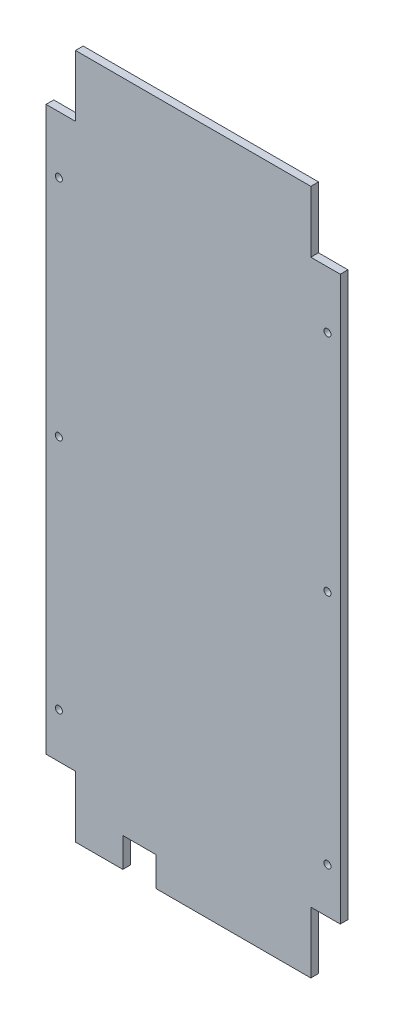
ISO-10303-21;
HEADER;
FILE_DESCRIPTION(('STEP AP214'),'2;1');
FILE_NAME('part.step','',(''),(''),'','','');
FILE_SCHEMA(('AUTOMOTIVE_DESIGN { 1 0 10303 214 1 1 1 1 }'));
ENDSEC;
DATA;
#1=APPLICATION_CONTEXT('core data for automotive mechanical design processes');
#2=APPLICATION_PROTOCOL_DEFINITION('international standard','automotive_design',2000,#1);
#3=PRODUCT_CONTEXT('',#1,'mechanical');
#4=PRODUCT('Part','Part','',(#3));
#5=PRODUCT_RELATED_PRODUCT_CATEGORY('part','',(#4));
#6=PRODUCT_DEFINITION_FORMATION('','',#4);
#7=PRODUCT_DEFINITION_CONTEXT('part definition',#1,'design');
#8=PRODUCT_DEFINITION('design','',#6,#7);
#9=PRODUCT_DEFINITION_SHAPE('','',#8);
#10=(LENGTH_UNIT() NAMED_UNIT(*) SI_UNIT(.MILLI.,.METRE.));
#11=(NAMED_UNIT(*) PLANE_ANGLE_UNIT() SI_UNIT($,.RADIAN.));
#12=(NAMED_UNIT(*) SI_UNIT($,.STERADIAN.) SOLID_ANGLE_UNIT());
#13=UNCERTAINTY_MEASURE_WITH_UNIT(LENGTH_MEASURE(1.E-05),#10,'distance_accuracy_value','');
#14=(GEOMETRIC_REPRESENTATION_CONTEXT(3) GLOBAL_UNCERTAINTY_ASSIGNED_CONTEXT((#13)) GLOBAL_UNIT_ASSIGNED_CONTEXT((#10,
#11,#12)) REPRESENTATION_CONTEXT('',''));
#15=CARTESIAN_POINT('',(0.,0.,0.));
#16=DIRECTION('',(0.,0.,1.));
#17=DIRECTION('',(1.,0.,0.));
#18=AXIS2_PLACEMENT_3D('',#15,#16,#17);
#19=CARTESIAN_POINT('',(-88.1852192827483,97.4126937302868,6.));
#20=DIRECTION('',(0.,-1.,0.));
#21=DIRECTION('',(0.,0.,-1.));
#22=AXIS2_PLACEMENT_3D('',#19,#20,#21);
#23=PLANE('',#22);
#24=DIRECTION('',(-1.,0.,0.));
#25=VECTOR('',#24,1.);
#26=CARTESIAN_POINT('',(-88.1852192827483,97.4126937302868,0.));
#27=LINE('',#26,#25);
#28=CARTESIAN_POINT('',(95.8147807172518,97.4126937302868,0.));
#29=VERTEX_POINT('',#28);
#30=CARTESIAN_POINT('',(-88.1852192827483,97.4126937302868,0.));
#31=VERTEX_POINT('',#30);
#32=EDGE_CURVE('E176',#29,#31,#27,.T.);
#33=ORIENTED_EDGE('',*,*,#32,.T.);
#34=DIRECTION('',(0.,0.,-1.));
#35=VECTOR('',#34,1.);
#36=CARTESIAN_POINT('',(-88.1852192827483,97.4126937302868,6.));
#37=LINE('',#36,#35);
#38=CARTESIAN_POINT('',(-88.1852192827483,97.4126937302868,6.));
#39=VERTEX_POINT('',#38);
#40=EDGE_CURVE('E11',#39,#31,#37,.T.);
#41=ORIENTED_EDGE('',*,*,#40,.F.);
#42=DIRECTION('',(-1.,0.,0.));
#43=VECTOR('',#42,1.);
#44=CARTESIAN_POINT('',(-88.1852192827483,97.4126937302868,6.));
#45=LINE('',#44,#43);
#46=CARTESIAN_POINT('',(95.8147807172518,97.4126937302868,6.));
#47=VERTEX_POINT('',#46);
#48=EDGE_CURVE('E207',#47,#39,#45,.T.);
#49=ORIENTED_EDGE('',*,*,#48,.F.);
#50=DIRECTION('',(0.,0.,-1.));
#51=VECTOR('',#50,1.);
#52=CARTESIAN_POINT('',(95.8147807172518,97.4126937302868,6.));
#53=LINE('',#52,#51);
#54=EDGE_CURVE('E172',#47,#29,#53,.T.);
#55=ORIENTED_EDGE('',*,*,#54,.T.);
#56=EDGE_LOOP('',(#33,#41,#49,#55));
#57=FACE_BOUND('',#56,.T.);
#58=ADVANCED_FACE('F32',(#57),#23,.F.);
#59=CARTESIAN_POINT('',(-88.1852192827483,49.4126937302866,6.));
#60=DIRECTION('',(1.,0.,0.));
#61=DIRECTION('',(0.,0.,-1.));
#62=AXIS2_PLACEMENT_3D('',#59,#60,#61);
#63=PLANE('',#62);
#64=DIRECTION('',(0.,-1.,0.));
#65=VECTOR('',#64,1.);
#66=CARTESIAN_POINT('',(-88.1852192827483,49.4126937302866,0.));
#67=LINE('',#66,#65);
#68=CARTESIAN_POINT('',(-88.1852192827483,49.4126937302866,0.));
#69=VERTEX_POINT('',#68);
#70=EDGE_CURVE('E179',#31,#69,#67,.T.);
#71=ORIENTED_EDGE('',*,*,#70,.T.);
#72=DIRECTION('',(0.,0.,-1.));
#73=VECTOR('',#72,1.);
#74=CARTESIAN_POINT('',(-88.1852192827483,49.4126937302866,6.));
#75=LINE('',#74,#73);
#76=CARTESIAN_POINT('',(-88.1852192827483,49.4126937302866,6.));
#77=VERTEX_POINT('',#76);
#78=EDGE_CURVE('E40',#77,#69,#75,.T.);
#79=ORIENTED_EDGE('',*,*,#78,.F.);
#80=DIRECTION('',(0.,-1.,0.));
#81=VECTOR('',#80,1.);
#82=CARTESIAN_POINT('',(-88.1852192827483,49.4126937302866,6.));
#83=LINE('',#82,#81);
#84=EDGE_CURVE('E115',#39,#77,#83,.T.);
#85=ORIENTED_EDGE('',*,*,#84,.F.);
#86=ORIENTED_EDGE('',*,*,#40,.T.);
#87=EDGE_LOOP('',(#71,#79,#85,#86));
#88=FACE_BOUND('',#87,.T.);
#89=ADVANCED_FACE('F307',(#88),#63,.F.);
#90=CARTESIAN_POINT('',(-111.185219282748,49.4126937302866,6.));
#91=DIRECTION('',(0.,-1.,0.));
#92=DIRECTION('',(0.,0.,-1.));
#93=AXIS2_PLACEMENT_3D('',#90,#91,#92);
#94=PLANE('',#93);
#95=DIRECTION('',(-1.,0.,0.));
#96=VECTOR('',#95,1.);
#97=CARTESIAN_POINT('',(-111.185219282748,49.4126937302866,0.));
#98=LINE('',#97,#96);
#99=CARTESIAN_POINT('',(-111.185219282748,49.4126937302866,0.));
#100=VERTEX_POINT('',#99);
#101=EDGE_CURVE('E182',#69,#100,#98,.T.);
#102=ORIENTED_EDGE('',*,*,#101,.T.);
#103=DIRECTION('',(0.,0.,-1.));
#104=VECTOR('',#103,1.);
#105=CARTESIAN_POINT('',(-111.185219282748,49.4126937302866,6.));
#106=LINE('',#105,#104);
#107=CARTESIAN_POINT('',(-111.185219282748,49.4126937302866,6.));
#108=VERTEX_POINT('',#107);
#109=EDGE_CURVE('E238',#108,#100,#106,.T.);
#110=ORIENTED_EDGE('',*,*,#109,.F.);
#111=DIRECTION('',(-1.,0.,0.));
#112=VECTOR('',#111,1.);
#113=CARTESIAN_POINT('',(-111.185219282748,49.4126937302866,6.));
#114=LINE('',#113,#112);
#115=EDGE_CURVE('E246',#77,#108,#114,.T.);
#116=ORIENTED_EDGE('',*,*,#115,.F.);
#117=ORIENTED_EDGE('',*,*,#78,.T.);
#118=EDGE_LOOP('',(#102,#110,#116,#117));
#119=FACE_BOUND('',#118,.T.);
#120=ADVANCED_FACE('F244',(#119),#94,.F.);
#121=CARTESIAN_POINT('',(-111.185219282748,49.4126937302866,6.));
#122=DIRECTION('',(1.,0.,0.));
#123=DIRECTION('',(0.,1.,0.));
#124=AXIS2_PLACEMENT_3D('',#121,#122,#123);
#125=PLANE('',#124);
#126=DIRECTION('',(0.,-1.,0.));
#127=VECTOR('',#126,1.);
#128=CARTESIAN_POINT('',(-111.185219282748,49.4126937302866,0.));
#129=LINE('',#128,#127);
#130=CARTESIAN_POINT('',(-111.185219282748,-390.587306269713,0.));
#131=VERTEX_POINT('',#130);
#132=EDGE_CURVE('E184',#100,#131,#129,.T.);
#133=ORIENTED_EDGE('',*,*,#132,.T.);
#134=DIRECTION('',(0.,0.,-1.));
#135=VECTOR('',#134,1.);
#136=CARTESIAN_POINT('',(-111.185219282748,-390.587306269713,6.));
#137=LINE('',#136,#135);
#138=CARTESIAN_POINT('',(-111.185219282748,-390.587306269713,6.));
#139=VERTEX_POINT('',#138);
#140=EDGE_CURVE('E235',#139,#131,#137,.T.);
#141=ORIENTED_EDGE('',*,*,#140,.F.);
#142=DIRECTION('',(0.,-1.,0.));
#143=VECTOR('',#142,1.);
#144=CARTESIAN_POINT('',(-111.185219282748,49.4126937302866,6.));
#145=LINE('',#144,#143);
#146=EDGE_CURVE('E264',#108,#139,#145,.T.);
#147=ORIENTED_EDGE('',*,*,#146,.F.);
#148=ORIENTED_EDGE('',*,*,#109,.T.);
#149=EDGE_LOOP('',(#133,#141,#147,#148));
#150=FACE_BOUND('',#149,.T.);
#151=ADVANCED_FACE('F255',(#150),#125,.F.);
#152=CARTESIAN_POINT('',(-88.1852192827483,-390.587306269713,6.));
#153=DIRECTION('',(0.,1.,0.));
#154=DIRECTION('',(-1.,0.,0.));
#155=AXIS2_PLACEMENT_3D('',#152,#153,#154);
#156=PLANE('',#155);
#157=DIRECTION('',(1.,0.,0.));
#158=VECTOR('',#157,1.);
#159=CARTESIAN_POINT('',(-88.1852192827483,-390.587306269713,0.));
#160=LINE('',#159,#158);
#161=CARTESIAN_POINT('',(-88.1852192827483,-390.587306269713,0.));
#162=VERTEX_POINT('',#161);
#163=EDGE_CURVE('E186',#131,#162,#160,.T.);
#164=ORIENTED_EDGE('',*,*,#163,.T.);
#165=DIRECTION('',(0.,0.,-1.));
#166=VECTOR('',#165,1.);
#167=CARTESIAN_POINT('',(-88.1852192827483,-390.587306269713,6.));
#168=LINE('',#167,#166);
#169=CARTESIAN_POINT('',(-88.1852192827483,-390.587306269713,6.));
#170=VERTEX_POINT('',#169);
#171=EDGE_CURVE('E232',#170,#162,#168,.T.);
#172=ORIENTED_EDGE('',*,*,#171,.F.);
#173=DIRECTION('',(1.,0.,0.));
#174=VECTOR('',#173,1.);
#175=CARTESIAN_POINT('',(-88.1852192827483,-390.587306269713,6.));
#176=LINE('',#175,#174);
#177=EDGE_CURVE('E261',#139,#170,#176,.T.);
#178=ORIENTED_EDGE('',*,*,#177,.F.);
#179=ORIENTED_EDGE('',*,*,#140,.T.);
#180=EDGE_LOOP('',(#164,#172,#178,#179));
#181=FACE_BOUND('',#180,.T.);
#182=ADVANCED_FACE('F259',(#181),#156,.F.);
#183=CARTESIAN_POINT('',(-88.1852192827483,-438.58730627295,6.));
#184=DIRECTION('',(1.,0.,0.));
#185=DIRECTION('',(0.,1.,0.));
#186=AXIS2_PLACEMENT_3D('',#183,#184,#185);
#187=PLANE('',#186);
#188=DIRECTION('',(0.,-1.,0.));
#189=VECTOR('',#188,1.);
#190=CARTESIAN_POINT('',(-88.1852192827483,-438.58730627295,0.));
#191=LINE('',#190,#189);
#192=CARTESIAN_POINT('',(-88.1852192827483,-438.58730627295,0.));
#193=VERTEX_POINT('',#192);
#194=EDGE_CURVE('E188',#162,#193,#191,.T.);
#195=ORIENTED_EDGE('',*,*,#194,.T.);
#196=DIRECTION('',(0.,0.,-1.));
#197=VECTOR('',#196,1.);
#198=CARTESIAN_POINT('',(-88.1852192827483,-438.58730627295,6.));
#199=LINE('',#198,#197);
#200=CARTESIAN_POINT('',(-88.1852192827483,-438.58730627295,6.));
#201=VERTEX_POINT('',#200);
#202=EDGE_CURVE('E229',#201,#193,#199,.T.);
#203=ORIENTED_EDGE('',*,*,#202,.F.);
#204=DIRECTION('',(0.,-1.,0.));
#205=VECTOR('',#204,1.);
#206=CARTESIAN_POINT('',(-88.1852192827483,-438.58730627295,6.));
#207=LINE('',#206,#205);
#208=EDGE_CURVE('E263',#170,#201,#207,.T.);
#209=ORIENTED_EDGE('',*,*,#208,.F.);
#210=ORIENTED_EDGE('',*,*,#171,.T.);
#211=EDGE_LOOP('',(#195,#203,#209,#210));
#212=FACE_BOUND('',#211,.T.);
#213=ADVANCED_FACE('F320',(#212),#187,.F.);
#214=CARTESIAN_POINT('',(-88.1852192827483,-438.58730627295,6.));
#215=DIRECTION('',(0.,1.,0.));
#216=DIRECTION('',(-1.,0.,0.));
#217=AXIS2_PLACEMENT_3D('',#214,#215,#216);
#218=PLANE('',#217);
#219=DIRECTION('',(1.,0.,0.));
#220=VECTOR('',#219,1.);
#221=CARTESIAN_POINT('',(-88.1852192827483,-438.58730627295,0.));
#222=LINE('',#221,#220);
#223=CARTESIAN_POINT('',(-51.1852192827482,-438.58730627295,0.));
#224=VERTEX_POINT('',#223);
#225=EDGE_CURVE('E190',#193,#224,#222,.T.);
#226=ORIENTED_EDGE('',*,*,#225,.T.);
#227=DIRECTION('',(0.,0.,-1.));
#228=VECTOR('',#227,1.);
#229=CARTESIAN_POINT('',(-51.1852192827482,-438.58730627295,6.));
#230=LINE('',#229,#228);
#231=CARTESIAN_POINT('',(-51.1852192827482,-438.58730627295,6.));
#232=VERTEX_POINT('',#231);
#233=EDGE_CURVE('E226',#232,#224,#230,.T.);
#234=ORIENTED_EDGE('',*,*,#233,.F.);
#235=DIRECTION('',(1.,0.,0.));
#236=VECTOR('',#235,1.);
#237=CARTESIAN_POINT('',(-88.1852192827483,-438.58730627295,6.));
#238=LINE('',#237,#236);
#239=EDGE_CURVE('E266',#201,#232,#238,.T.);
#240=ORIENTED_EDGE('',*,*,#239,.F.);
#241=ORIENTED_EDGE('',*,*,#202,.T.);
#242=EDGE_LOOP('',(#226,#234,#240,#241));
#243=FACE_BOUND('',#242,.T.);
#244=ADVANCED_FACE('F323',(#243),#218,.F.);
#245=CARTESIAN_POINT('',(-51.1852192827482,-415.58730627295,6.));
#246=DIRECTION('',(-1.,0.,0.));
#247=DIRECTION('',(0.,0.,1.));
#248=AXIS2_PLACEMENT_3D('',#245,#246,#247);
#249=PLANE('',#248);
#250=DIRECTION('',(0.,1.,0.));
#251=VECTOR('',#250,1.);
#252=CARTESIAN_POINT('',(-51.1852192827482,-415.58730627295,0.));
#253=LINE('',#252,#251);
#254=CARTESIAN_POINT('',(-51.1852192827482,-415.58730627295,0.));
#255=VERTEX_POINT('',#254);
#256=EDGE_CURVE('E192',#224,#255,#253,.T.);
#257=ORIENTED_EDGE('',*,*,#256,.T.);
#258=DIRECTION('',(0.,0.,-1.));
#259=VECTOR('',#258,1.);
#260=CARTESIAN_POINT('',(-51.1852192827482,-415.58730627295,6.));
#261=LINE('',#260,#259);
#262=CARTESIAN_POINT('',(-51.1852192827482,-415.58730627295,6.));
#263=VERTEX_POINT('',#262);
#264=EDGE_CURVE('E223',#263,#255,#261,.T.);
#265=ORIENTED_EDGE('',*,*,#264,.F.);
#266=DIRECTION('',(0.,1.,0.));
#267=VECTOR('',#266,1.);
#268=CARTESIAN_POINT('',(-51.1852192827482,-415.58730627295,6.));
#269=LINE('',#268,#267);
#270=EDGE_CURVE('E272',#232,#263,#269,.T.);
#271=ORIENTED_EDGE('',*,*,#270,.F.);
#272=ORIENTED_EDGE('',*,*,#233,.T.);
#273=EDGE_LOOP('',(#257,#265,#271,#272));
#274=FACE_BOUND('',#273,.T.);
#275=ADVANCED_FACE('F327',(#274),#249,.F.);
#276=CARTESIAN_POINT('',(-51.1852192827482,-415.58730627295,6.));
#277=DIRECTION('',(0.,1.,0.));
#278=DIRECTION('',(-1.,0.,0.));
#279=AXIS2_PLACEMENT_3D('',#276,#277,#278);
#280=PLANE('',#279);
#281=DIRECTION('',(1.,0.,0.));
#282=VECTOR('',#281,1.);
#283=CARTESIAN_POINT('',(-51.1852192827482,-415.58730627295,0.));
#284=LINE('',#283,#282);
#285=CARTESIAN_POINT('',(-25.1852192827482,-415.58730627295,0.));
#286=VERTEX_POINT('',#285);
#287=EDGE_CURVE('E194',#255,#286,#284,.T.);
#288=ORIENTED_EDGE('',*,*,#287,.T.);
#289=DIRECTION('',(0.,0.,-1.));
#290=VECTOR('',#289,1.);
#291=CARTESIAN_POINT('',(-25.1852192827482,-415.58730627295,6.));
#292=LINE('',#291,#290);
#293=CARTESIAN_POINT('',(-25.1852192827482,-415.58730627295,6.));
#294=VERTEX_POINT('',#293);
#295=EDGE_CURVE('E220',#294,#286,#292,.T.);
#296=ORIENTED_EDGE('',*,*,#295,.F.);
#297=DIRECTION('',(1.,0.,0.));
#298=VECTOR('',#297,1.);
#299=CARTESIAN_POINT('',(-51.1852192827482,-415.58730627295,6.));
#300=LINE('',#299,#298);
#301=EDGE_CURVE('E274',#263,#294,#300,.T.);
#302=ORIENTED_EDGE('',*,*,#301,.F.);
#303=ORIENTED_EDGE('',*,*,#264,.T.);
#304=EDGE_LOOP('',(#288,#296,#302,#303));
#305=FACE_BOUND('',#304,.T.);
#306=ADVANCED_FACE('F331',(#305),#280,.F.);
#307=CARTESIAN_POINT('',(-25.1852192827482,-415.58730627295,6.));
#308=DIRECTION('',(1.,0.,0.));
#309=DIRECTION('',(0.,0.,-1.));
#310=AXIS2_PLACEMENT_3D('',#307,#308,#309);
#311=PLANE('',#310);
#312=DIRECTION('',(0.,-1.,0.));
#313=VECTOR('',#312,1.);
#314=CARTESIAN_POINT('',(-25.1852192827482,-415.58730627295,0.));
#315=LINE('',#314,#313);
#316=CARTESIAN_POINT('',(-25.1852192827482,-438.58730627295,0.));
#317=VERTEX_POINT('',#316);
#318=EDGE_CURVE('E196',#286,#317,#315,.T.);
#319=ORIENTED_EDGE('',*,*,#318,.T.);
#320=DIRECTION('',(0.,0.,-1.));
#321=VECTOR('',#320,1.);
#322=CARTESIAN_POINT('',(-25.1852192827482,-438.58730627295,6.));
#323=LINE('',#322,#321);
#324=CARTESIAN_POINT('',(-25.1852192827482,-438.58730627295,6.));
#325=VERTEX_POINT('',#324);
#326=EDGE_CURVE('E217',#325,#317,#323,.T.);
#327=ORIENTED_EDGE('',*,*,#326,.F.);
#328=DIRECTION('',(0.,-1.,0.));
#329=VECTOR('',#328,1.);
#330=CARTESIAN_POINT('',(-25.1852192827482,-415.58730627295,6.));
#331=LINE('',#330,#329);
#332=EDGE_CURVE('E276',#294,#325,#331,.T.);
#333=ORIENTED_EDGE('',*,*,#332,.F.);
#334=ORIENTED_EDGE('',*,*,#295,.T.);
#335=EDGE_LOOP('',(#319,#327,#333,#334));
#336=FACE_BOUND('',#335,.T.);
#337=ADVANCED_FACE('F335',(#336),#311,.F.);
#338=CARTESIAN_POINT('',(95.8147807172518,-438.58730627295,6.));
#339=DIRECTION('',(0.,1.,0.));
#340=DIRECTION('',(0.,0.,1.));
#341=AXIS2_PLACEMENT_3D('',#338,#339,#340);
#342=PLANE('',#341);
#343=DIRECTION('',(1.,0.,0.));
#344=VECTOR('',#343,1.);
#345=CARTESIAN_POINT('',(95.8147807172518,-438.58730627295,0.));
#346=LINE('',#345,#344);
#347=CARTESIAN_POINT('',(95.8147807172518,-438.58730627295,0.));
#348=VERTEX_POINT('',#347);
#349=EDGE_CURVE('E198',#317,#348,#346,.T.);
#350=ORIENTED_EDGE('',*,*,#349,.T.);
#351=DIRECTION('',(0.,0.,-1.));
#352=VECTOR('',#351,1.);
#353=CARTESIAN_POINT('',(95.8147807172518,-438.58730627295,6.));
#354=LINE('',#353,#352);
#355=CARTESIAN_POINT('',(95.8147807172518,-438.58730627295,6.));
#356=VERTEX_POINT('',#355);
#357=EDGE_CURVE('E214',#356,#348,#354,.T.);
#358=ORIENTED_EDGE('',*,*,#357,.F.);
#359=DIRECTION('',(1.,0.,0.));
#360=VECTOR('',#359,1.);
#361=CARTESIAN_POINT('',(95.8147807172518,-438.58730627295,6.));
#362=LINE('',#361,#360);
#363=EDGE_CURVE('E278',#325,#356,#362,.T.);
#364=ORIENTED_EDGE('',*,*,#363,.F.);
#365=ORIENTED_EDGE('',*,*,#326,.T.);
#366=EDGE_LOOP('',(#350,#358,#364,#365));
#367=FACE_BOUND('',#366,.T.);
#368=ADVANCED_FACE('F339',(#367),#342,.F.);
#369=CARTESIAN_POINT('',(95.8147807172518,-438.58730627295,6.));
#370=DIRECTION('',(-1.,0.,0.));
#371=DIRECTION('',(0.,0.,1.));
#372=AXIS2_PLACEMENT_3D('',#369,#370,#371);
#373=PLANE('',#372);
#374=DIRECTION('',(0.,1.,0.));
#375=VECTOR('',#374,1.);
#376=CARTESIAN_POINT('',(95.8147807172518,-438.58730627295,0.));
#377=LINE('',#376,#375);
#378=CARTESIAN_POINT('',(95.8147807172518,-390.587306269713,0.));
#379=VERTEX_POINT('',#378);
#380=EDGE_CURVE('E200',#348,#379,#377,.T.);
#381=ORIENTED_EDGE('',*,*,#380,.T.);
#382=DIRECTION('',(0.,0.,-1.));
#383=VECTOR('',#382,1.);
#384=CARTESIAN_POINT('',(95.8147807172518,-390.587306269713,6.));
#385=LINE('',#384,#383);
#386=CARTESIAN_POINT('',(95.8147807172518,-390.587306269713,6.));
#387=VERTEX_POINT('',#386);
#388=EDGE_CURVE('E211',#387,#379,#385,.T.);
#389=ORIENTED_EDGE('',*,*,#388,.F.);
#390=DIRECTION('',(0.,1.,0.));
#391=VECTOR('',#390,1.);
#392=CARTESIAN_POINT('',(95.8147807172518,-438.58730627295,6.));
#393=LINE('',#392,#391);
#394=EDGE_CURVE('E280',#356,#387,#393,.T.);
#395=ORIENTED_EDGE('',*,*,#394,.F.);
#396=ORIENTED_EDGE('',*,*,#357,.T.);
#397=EDGE_LOOP('',(#381,#389,#395,#396));
#398=FACE_BOUND('',#397,.T.);
#399=ADVANCED_FACE('F286',(#398),#373,.F.);
#400=CARTESIAN_POINT('',(95.8147807172518,-390.587306269713,6.));
#401=DIRECTION('',(0.,1.,0.));
#402=DIRECTION('',(0.,0.,1.));
#403=AXIS2_PLACEMENT_3D('',#400,#401,#402);
#404=PLANE('',#403);
#405=DIRECTION('',(1.,0.,0.));
#406=VECTOR('',#405,1.);
#407=CARTESIAN_POINT('',(95.8147807172518,-390.587306269713,0.));
#408=LINE('',#407,#406);
#409=CARTESIAN_POINT('',(118.814780717252,-390.587306269713,0.));
#410=VERTEX_POINT('',#409);
#411=EDGE_CURVE('E202',#379,#410,#408,.T.);
#412=ORIENTED_EDGE('',*,*,#411,.T.);
#413=DIRECTION('',(0.,0.,-1.));
#414=VECTOR('',#413,1.);
#415=CARTESIAN_POINT('',(118.814780717252,-390.587306269713,6.));
#416=LINE('',#415,#414);
#417=CARTESIAN_POINT('',(118.814780717252,-390.587306269713,6.));
#418=VERTEX_POINT('',#417);
#419=EDGE_CURVE('E167',#418,#410,#416,.T.);
#420=ORIENTED_EDGE('',*,*,#419,.F.);
#421=DIRECTION('',(1.,0.,0.));
#422=VECTOR('',#421,1.);
#423=CARTESIAN_POINT('',(95.8147807172518,-390.587306269713,6.));
#424=LINE('',#423,#422);
#425=EDGE_CURVE('E158',#387,#418,#424,.T.);
#426=ORIENTED_EDGE('',*,*,#425,.F.);
#427=ORIENTED_EDGE('',*,*,#388,.T.);
#428=EDGE_LOOP('',(#412,#420,#426,#427));
#429=FACE_BOUND('',#428,.T.);
#430=ADVANCED_FACE('F290',(#429),#404,.F.);
#431=CARTESIAN_POINT('',(118.814780717252,49.4126937302866,6.));
#432=DIRECTION('',(-1.,0.,0.));
#433=DIRECTION('',(0.,-1.,0.));
#434=AXIS2_PLACEMENT_3D('',#431,#432,#433);
#435=PLANE('',#434);
#436=DIRECTION('',(0.,1.,0.));
#437=VECTOR('',#436,1.);
#438=CARTESIAN_POINT('',(118.814780717252,49.4126937302866,0.));
#439=LINE('',#438,#437);
#440=CARTESIAN_POINT('',(118.814780717252,49.4126937302866,0.));
#441=VERTEX_POINT('',#440);
#442=EDGE_CURVE('E166',#410,#441,#439,.T.);
#443=ORIENTED_EDGE('',*,*,#442,.T.);
#444=DIRECTION('',(0.,0.,-1.));
#445=VECTOR('',#444,1.);
#446=CARTESIAN_POINT('',(118.814780717252,49.4126937302866,6.));
#447=LINE('',#446,#445);
#448=CARTESIAN_POINT('',(118.814780717252,49.4126937302866,6.));
#449=VERTEX_POINT('',#448);
#450=EDGE_CURVE('E163',#449,#441,#447,.T.);
#451=ORIENTED_EDGE('',*,*,#450,.F.);
#452=DIRECTION('',(0.,1.,0.));
#453=VECTOR('',#452,1.);
#454=CARTESIAN_POINT('',(118.814780717252,49.4126937302866,6.));
#455=LINE('',#454,#453);
#456=EDGE_CURVE('E152',#418,#449,#455,.T.);
#457=ORIENTED_EDGE('',*,*,#456,.F.);
#458=ORIENTED_EDGE('',*,*,#419,.T.);
#459=EDGE_LOOP('',(#443,#451,#457,#458));
#460=FACE_BOUND('',#459,.T.);
#461=ADVANCED_FACE('F164',(#460),#435,.F.);
#462=CARTESIAN_POINT('',(95.8147807172518,49.4126937302866,6.));
#463=DIRECTION('',(0.,-1.,0.));
#464=DIRECTION('',(0.,0.,-1.));
#465=AXIS2_PLACEMENT_3D('',#462,#463,#464);
#466=PLANE('',#465);
#467=DIRECTION('',(-1.,0.,0.));
#468=VECTOR('',#467,1.);
#469=CARTESIAN_POINT('',(95.8147807172518,49.4126937302866,0.));
#470=LINE('',#469,#468);
#471=CARTESIAN_POINT('',(95.8147807172518,49.4126937302866,0.));
#472=VERTEX_POINT('',#471);
#473=EDGE_CURVE('E101',#441,#472,#470,.T.);
#474=ORIENTED_EDGE('',*,*,#473,.T.);
#475=DIRECTION('',(0.,0.,-1.));
#476=VECTOR('',#475,1.);
#477=CARTESIAN_POINT('',(95.8147807172518,49.4126937302866,6.));
#478=LINE('',#477,#476);
#479=CARTESIAN_POINT('',(95.8147807172518,49.4126937302866,6.));
#480=VERTEX_POINT('',#479);
#481=EDGE_CURVE('E168',#480,#472,#478,.T.);
#482=ORIENTED_EDGE('',*,*,#481,.F.);
#483=DIRECTION('',(-1.,0.,0.));
#484=VECTOR('',#483,1.);
#485=CARTESIAN_POINT('',(95.8147807172518,49.4126937302866,6.));
#486=LINE('',#485,#484);
#487=EDGE_CURVE('E156',#449,#480,#486,.T.);
#488=ORIENTED_EDGE('',*,*,#487,.F.);
#489=ORIENTED_EDGE('',*,*,#450,.T.);
#490=EDGE_LOOP('',(#474,#482,#488,#489));
#491=FACE_BOUND('',#490,.T.);
#492=ADVANCED_FACE('F170',(#491),#466,.F.);
#493=CARTESIAN_POINT('',(95.8147807172518,97.4126937302868,6.));
#494=DIRECTION('',(-1.,0.,0.));
#495=DIRECTION('',(0.,0.,1.));
#496=AXIS2_PLACEMENT_3D('',#493,#494,#495);
#497=PLANE('',#496);
#498=DIRECTION('',(0.,1.,0.));
#499=VECTOR('',#498,1.);
#500=CARTESIAN_POINT('',(95.8147807172518,97.4126937302868,0.));
#501=LINE('',#500,#499);
#502=EDGE_CURVE('E107',#472,#29,#501,.T.);
#503=ORIENTED_EDGE('',*,*,#502,.T.);
#504=ORIENTED_EDGE('',*,*,#54,.F.);
#505=DIRECTION('',(0.,1.,0.));
#506=VECTOR('',#505,1.);
#507=CARTESIAN_POINT('',(95.8147807172518,97.4126937302868,6.));
#508=LINE('',#507,#506);
#509=EDGE_CURVE('E48',#480,#47,#508,.T.);
#510=ORIENTED_EDGE('',*,*,#509,.F.);
#511=ORIENTED_EDGE('',*,*,#481,.T.);
#512=EDGE_LOOP('',(#503,#504,#510,#511));
#513=FACE_BOUND('',#512,.T.);
#514=ADVANCED_FACE('F294',(#513),#497,.F.);
#515=CARTESIAN_POINT('',(0.,0.,6.));
#516=DIRECTION('',(0.,0.,-1.));
#517=DIRECTION('',(-1.,0.,0.));
#518=AXIS2_PLACEMENT_3D('',#515,#516,#517);
#519=PLANE('',#518);
#520=CARTESIAN_POINT('',(108.814780717252,4.83489116466262,6.));
#521=DIRECTION('',(0.,0.,-1.));
#522=DIRECTION('',(-1.,0.,0.));
#523=AXIS2_PLACEMENT_3D('',#520,#521,#522);
#524=CIRCLE('',#523,2.75000000000001);
#525=CARTESIAN_POINT('',(106.064780717252,4.83489116466262,6.));
#526=VERTEX_POINT('',#525);
#527=EDGE_CURVE('E440',#526,#526,#524,.T.);
#528=ORIENTED_EDGE('',*,*,#527,.T.);
#529=EDGE_LOOP('',(#528));
#530=FACE_BOUND('',#529,.T.);
#531=CARTESIAN_POINT('',(108.814780717252,-355.33665530924,6.));
#532=DIRECTION('',(0.,0.,-1.));
#533=DIRECTION('',(-1.,0.,0.));
#534=AXIS2_PLACEMENT_3D('',#531,#532,#533);
#535=CIRCLE('',#534,2.75000000000001);
#536=CARTESIAN_POINT('',(106.064780717252,-355.33665530924,6.));
#537=VERTEX_POINT('',#536);
#538=EDGE_CURVE('E442',#537,#537,#535,.T.);
#539=ORIENTED_EDGE('',*,*,#538,.T.);
#540=EDGE_LOOP('',(#539));
#541=FACE_BOUND('',#540,.T.);
#542=CARTESIAN_POINT('',(-101.185219282748,4.83489116466262,6.));
#543=DIRECTION('',(0.,0.,-1.));
#544=DIRECTION('',(-1.,0.,0.));
#545=AXIS2_PLACEMENT_3D('',#542,#543,#544);
#546=CIRCLE('',#545,2.75000000000001);
#547=CARTESIAN_POINT('',(-103.935219282748,4.83489116466262,6.));
#548=VERTEX_POINT('',#547);
#549=EDGE_CURVE('E447',#548,#548,#546,.T.);
#550=ORIENTED_EDGE('',*,*,#549,.T.);
#551=EDGE_LOOP('',(#550));
#552=FACE_BOUND('',#551,.T.);
#553=CARTESIAN_POINT('',(-101.185219282748,-170.587306269713,6.));
#554=DIRECTION('',(0.,0.,-1.));
#555=DIRECTION('',(-1.,0.,0.));
#556=AXIS2_PLACEMENT_3D('',#553,#554,#555);
#557=CIRCLE('',#556,2.75000000000001);
#558=CARTESIAN_POINT('',(-103.935219282748,-170.587306269713,6.));
#559=VERTEX_POINT('',#558);
#560=EDGE_CURVE('E459',#559,#559,#557,.T.);
#561=ORIENTED_EDGE('',*,*,#560,.T.);
#562=EDGE_LOOP('',(#561));
#563=FACE_BOUND('',#562,.T.);
#564=CARTESIAN_POINT('',(-101.185219282748,-355.33665530924,6.));
#565=DIRECTION('',(0.,0.,-1.));
#566=DIRECTION('',(-1.,0.,0.));
#567=AXIS2_PLACEMENT_3D('',#564,#565,#566);
#568=CIRCLE('',#567,2.75000000000001);
#569=CARTESIAN_POINT('',(-103.935219282748,-355.33665530924,6.));
#570=VERTEX_POINT('',#569);
#571=EDGE_CURVE('E462',#570,#570,#568,.T.);
#572=ORIENTED_EDGE('',*,*,#571,.T.);
#573=EDGE_LOOP('',(#572));
#574=FACE_BOUND('',#573,.T.);
#575=CARTESIAN_POINT('',(108.814780717252,-170.587306269713,6.));
#576=DIRECTION('',(0.,0.,-1.));
#577=DIRECTION('',(-1.,0.,0.));
#578=AXIS2_PLACEMENT_3D('',#575,#576,#577);
#579=CIRCLE('',#578,2.75000000000001);
#580=CARTESIAN_POINT('',(106.064780717252,-170.587306269713,6.));
#581=VERTEX_POINT('',#580);
#582=EDGE_CURVE('E180',#581,#581,#579,.T.);
#583=ORIENTED_EDGE('',*,*,#582,.T.);
#584=EDGE_LOOP('',(#583));
#585=FACE_BOUND('',#584,.T.);
#586=ORIENTED_EDGE('',*,*,#48,.T.);
#587=ORIENTED_EDGE('',*,*,#84,.T.);
#588=ORIENTED_EDGE('',*,*,#115,.T.);
#589=ORIENTED_EDGE('',*,*,#146,.T.);
#590=ORIENTED_EDGE('',*,*,#177,.T.);
#591=ORIENTED_EDGE('',*,*,#208,.T.);
#592=ORIENTED_EDGE('',*,*,#239,.T.);
#593=ORIENTED_EDGE('',*,*,#270,.T.);
#594=ORIENTED_EDGE('',*,*,#301,.T.);
#595=ORIENTED_EDGE('',*,*,#332,.T.);
#596=ORIENTED_EDGE('',*,*,#363,.T.);
#597=ORIENTED_EDGE('',*,*,#394,.T.);
#598=ORIENTED_EDGE('',*,*,#425,.T.);
#599=ORIENTED_EDGE('',*,*,#456,.T.);
#600=ORIENTED_EDGE('',*,*,#487,.T.);
#601=ORIENTED_EDGE('',*,*,#509,.T.);
#602=EDGE_LOOP('',(#586,#587,#588,#589,#590,#591,#592,#593,#594,#595,#596,#597,#598,#599,#600,#601));
#603=FACE_BOUND('',#602,.T.);
#604=ADVANCED_FACE('F154',(#530,#541,#552,#563,#574,#585,#603),#519,.F.);
#605=CARTESIAN_POINT('',(0.,0.,0.));
#606=DIRECTION('',(0.,0.,-1.));
#607=DIRECTION('',(-1.,0.,0.));
#608=AXIS2_PLACEMENT_3D('',#605,#606,#607);
#609=PLANE('',#608);
#610=CARTESIAN_POINT('',(108.814780717252,4.83489116466262,0.));
#611=DIRECTION('',(0.,0.,-1.));
#612=DIRECTION('',(-1.,0.,0.));
#613=AXIS2_PLACEMENT_3D('',#610,#611,#612);
#614=CIRCLE('',#613,2.75000000000001);
#615=CARTESIAN_POINT('',(106.064780717252,4.83489116466262,0.));
#616=VERTEX_POINT('',#615);
#617=EDGE_CURVE('E437',#616,#616,#614,.T.);
#618=ORIENTED_EDGE('',*,*,#617,.F.);
#619=EDGE_LOOP('',(#618));
#620=FACE_BOUND('',#619,.T.);
#621=CARTESIAN_POINT('',(108.814780717252,-355.33665530924,0.));
#622=DIRECTION('',(0.,0.,-1.));
#623=DIRECTION('',(-1.,0.,0.));
#624=AXIS2_PLACEMENT_3D('',#621,#622,#623);
#625=CIRCLE('',#624,2.75000000000001);
#626=CARTESIAN_POINT('',(106.064780717252,-355.33665530924,0.));
#627=VERTEX_POINT('',#626);
#628=EDGE_CURVE('E474',#627,#627,#625,.T.);
#629=ORIENTED_EDGE('',*,*,#628,.F.);
#630=EDGE_LOOP('',(#629));
#631=FACE_BOUND('',#630,.T.);
#632=CARTESIAN_POINT('',(-101.185219282748,4.83489116466262,0.));
#633=DIRECTION('',(0.,0.,-1.));
#634=DIRECTION('',(-1.,0.,0.));
#635=AXIS2_PLACEMENT_3D('',#632,#633,#634);
#636=CIRCLE('',#635,2.75000000000001);
#637=CARTESIAN_POINT('',(-103.935219282748,4.83489116466262,0.));
#638=VERTEX_POINT('',#637);
#639=EDGE_CURVE('E471',#638,#638,#636,.T.);
#640=ORIENTED_EDGE('',*,*,#639,.F.);
#641=EDGE_LOOP('',(#640));
#642=FACE_BOUND('',#641,.T.);
#643=CARTESIAN_POINT('',(-101.185219282748,-170.587306269713,0.));
#644=DIRECTION('',(0.,0.,-1.));
#645=DIRECTION('',(-1.,0.,0.));
#646=AXIS2_PLACEMENT_3D('',#643,#644,#645);
#647=CIRCLE('',#646,2.75000000000001);
#648=CARTESIAN_POINT('',(-103.935219282748,-170.587306269713,0.));
#649=VERTEX_POINT('',#648);
#650=EDGE_CURVE('E468',#649,#649,#647,.T.);
#651=ORIENTED_EDGE('',*,*,#650,.F.);
#652=EDGE_LOOP('',(#651));
#653=FACE_BOUND('',#652,.T.);
#654=CARTESIAN_POINT('',(-101.185219282748,-355.33665530924,0.));
#655=DIRECTION('',(0.,0.,-1.));
#656=DIRECTION('',(-1.,0.,0.));
#657=AXIS2_PLACEMENT_3D('',#654,#655,#656);
#658=CIRCLE('',#657,2.75000000000001);
#659=CARTESIAN_POINT('',(-103.935219282748,-355.33665530924,0.));
#660=VERTEX_POINT('',#659);
#661=EDGE_CURVE('E465',#660,#660,#658,.T.);
#662=ORIENTED_EDGE('',*,*,#661,.F.);
#663=EDGE_LOOP('',(#662));
#664=FACE_BOUND('',#663,.T.);
#665=CARTESIAN_POINT('',(108.814780717252,-170.587306269713,0.));
#666=DIRECTION('',(0.,0.,-1.));
#667=DIRECTION('',(-1.,0.,0.));
#668=AXIS2_PLACEMENT_3D('',#665,#666,#667);
#669=CIRCLE('',#668,2.75000000000001);
#670=CARTESIAN_POINT('',(106.064780717252,-170.587306269713,0.));
#671=VERTEX_POINT('',#670);
#672=EDGE_CURVE('E441',#671,#671,#669,.T.);
#673=ORIENTED_EDGE('',*,*,#672,.F.);
#674=EDGE_LOOP('',(#673));
#675=FACE_BOUND('',#674,.T.);
#676=ORIENTED_EDGE('',*,*,#32,.F.);
#677=ORIENTED_EDGE('',*,*,#502,.F.);
#678=ORIENTED_EDGE('',*,*,#473,.F.);
#679=ORIENTED_EDGE('',*,*,#442,.F.);
#680=ORIENTED_EDGE('',*,*,#411,.F.);
#681=ORIENTED_EDGE('',*,*,#380,.F.);
#682=ORIENTED_EDGE('',*,*,#349,.F.);
#683=ORIENTED_EDGE('',*,*,#318,.F.);
#684=ORIENTED_EDGE('',*,*,#287,.F.);
#685=ORIENTED_EDGE('',*,*,#256,.F.);
#686=ORIENTED_EDGE('',*,*,#225,.F.);
#687=ORIENTED_EDGE('',*,*,#194,.F.);
#688=ORIENTED_EDGE('',*,*,#163,.F.);
#689=ORIENTED_EDGE('',*,*,#132,.F.);
#690=ORIENTED_EDGE('',*,*,#101,.F.);
#691=ORIENTED_EDGE('',*,*,#70,.F.);
#692=EDGE_LOOP('',(#676,#677,#678,#679,#680,#681,#682,#683,#684,#685,#686,#687,#688,#689,#690,#691));
#693=FACE_BOUND('',#692,.T.);
#694=ADVANCED_FACE('F250',(#620,#631,#642,#653,#664,#675,#693),#609,.T.);
#695=CARTESIAN_POINT('',(108.814780717252,-170.587306269713,10.));
#696=DIRECTION('',(0.,0.,-1.));
#697=DIRECTION('',(-1.,0.,0.));
#698=AXIS2_PLACEMENT_3D('',#695,#696,#697);
#699=CYLINDRICAL_SURFACE('',#698,2.75000000000001);
#700=ORIENTED_EDGE('',*,*,#672,.T.);
#701=EDGE_LOOP('',(#700));
#702=FACE_BOUND('',#701,.T.);
#703=ORIENTED_EDGE('',*,*,#582,.F.);
#704=EDGE_LOOP('',(#703));
#705=FACE_BOUND('',#704,.T.);
#706=ADVANCED_FACE('F372',(#702,#705),#699,.F.);
#707=CARTESIAN_POINT('',(-101.185219282748,-355.33665530924,10.));
#708=DIRECTION('',(0.,0.,-1.));
#709=DIRECTION('',(-1.,0.,0.));
#710=AXIS2_PLACEMENT_3D('',#707,#708,#709);
#711=CYLINDRICAL_SURFACE('',#710,2.75000000000001);
#712=ORIENTED_EDGE('',*,*,#661,.T.);
#713=EDGE_LOOP('',(#712));
#714=FACE_BOUND('',#713,.T.);
#715=ORIENTED_EDGE('',*,*,#571,.F.);
#716=EDGE_LOOP('',(#715));
#717=FACE_BOUND('',#716,.T.);
#718=ADVANCED_FACE('F380',(#714,#717),#711,.F.);
#719=CARTESIAN_POINT('',(-101.185219282748,-170.587306269713,10.));
#720=DIRECTION('',(0.,0.,-1.));
#721=DIRECTION('',(-1.,0.,0.));
#722=AXIS2_PLACEMENT_3D('',#719,#720,#721);
#723=CYLINDRICAL_SURFACE('',#722,2.75000000000001);
#724=ORIENTED_EDGE('',*,*,#650,.T.);
#725=EDGE_LOOP('',(#724));
#726=FACE_BOUND('',#725,.T.);
#727=ORIENTED_EDGE('',*,*,#560,.F.);
#728=EDGE_LOOP('',(#727));
#729=FACE_BOUND('',#728,.T.);
#730=ADVANCED_FACE('F390',(#726,#729),#723,.F.);
#731=CARTESIAN_POINT('',(-101.185219282748,4.83489116466262,10.));
#732=DIRECTION('',(0.,0.,-1.));
#733=DIRECTION('',(-1.,0.,0.));
#734=AXIS2_PLACEMENT_3D('',#731,#732,#733);
#735=CYLINDRICAL_SURFACE('',#734,2.75000000000001);
#736=ORIENTED_EDGE('',*,*,#639,.T.);
#737=EDGE_LOOP('',(#736));
#738=FACE_BOUND('',#737,.T.);
#739=ORIENTED_EDGE('',*,*,#549,.F.);
#740=EDGE_LOOP('',(#739));
#741=FACE_BOUND('',#740,.T.);
#742=ADVANCED_FACE('F400',(#738,#741),#735,.F.);
#743=CARTESIAN_POINT('',(108.814780717252,-355.33665530924,10.));
#744=DIRECTION('',(0.,0.,-1.));
#745=DIRECTION('',(-1.,0.,0.));
#746=AXIS2_PLACEMENT_3D('',#743,#744,#745);
#747=CYLINDRICAL_SURFACE('',#746,2.75000000000001);
#748=ORIENTED_EDGE('',*,*,#628,.T.);
#749=EDGE_LOOP('',(#748));
#750=FACE_BOUND('',#749,.T.);
#751=ORIENTED_EDGE('',*,*,#538,.F.);
#752=EDGE_LOOP('',(#751));
#753=FACE_BOUND('',#752,.T.);
#754=ADVANCED_FACE('F410',(#750,#753),#747,.F.);
#755=CARTESIAN_POINT('',(108.814780717252,4.83489116466262,10.));
#756=DIRECTION('',(0.,0.,-1.));
#757=DIRECTION('',(-1.,0.,0.));
#758=AXIS2_PLACEMENT_3D('',#755,#756,#757);
#759=CYLINDRICAL_SURFACE('',#758,2.75000000000001);
#760=ORIENTED_EDGE('',*,*,#617,.T.);
#761=EDGE_LOOP('',(#760));
#762=FACE_BOUND('',#761,.T.);
#763=ORIENTED_EDGE('',*,*,#527,.F.);
#764=EDGE_LOOP('',(#763));
#765=FACE_BOUND('',#764,.T.);
#766=ADVANCED_FACE('F420',(#762,#765),#759,.F.);
#767=CLOSED_SHELL('',(#58,#89,#120,#151,#182,#213,#244,#275,#306,#337,#368,#399,#430,#461,#492,
#514,#604,#694,#706,#718,#730,#742,#754,#766));
#768=MANIFOLD_SOLID_BREP('B2',#767);
#769=ADVANCED_BREP_SHAPE_REPRESENTATION('',(#18,#768),#14);
#770=SHAPE_DEFINITION_REPRESENTATION(#9,#769);
ENDSEC;
END-ISO-10303-21;
